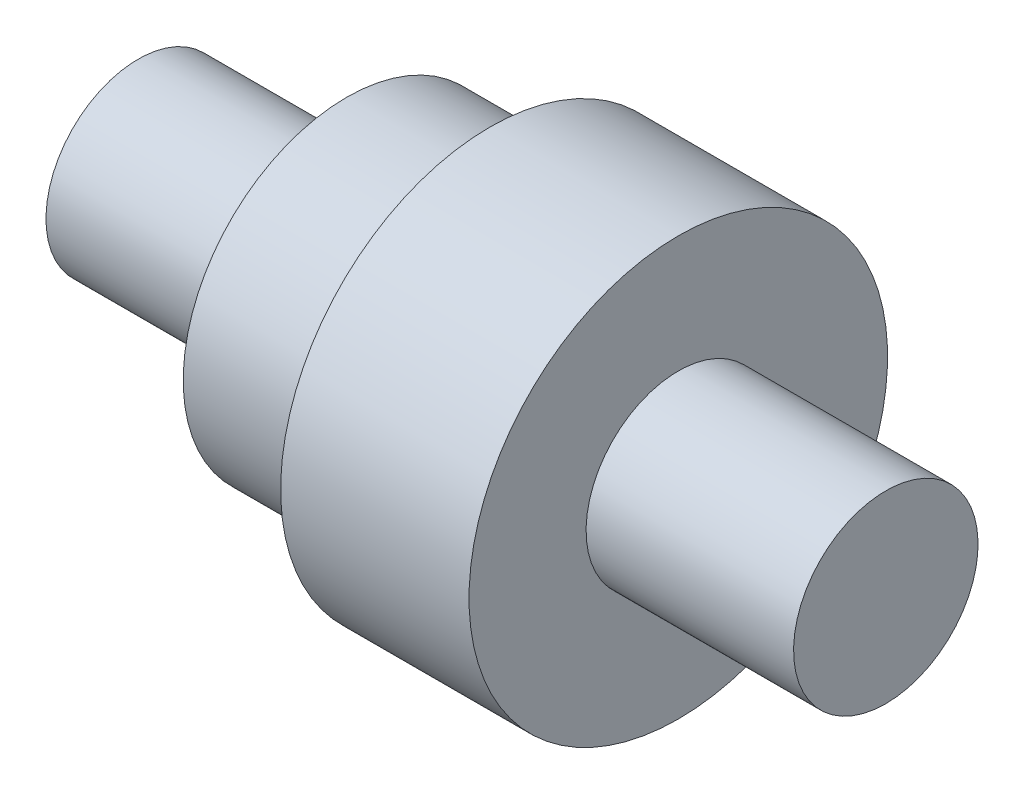
ISO-10303-21;
HEADER;
FILE_DESCRIPTION(('STEP AP214'),'2;1');
FILE_NAME('part.step','',(''),(''),'','','');
FILE_SCHEMA(('AUTOMOTIVE_DESIGN { 1 0 10303 214 1 1 1 1 }'));
ENDSEC;
DATA;
#1=APPLICATION_CONTEXT('core data for automotive mechanical design processes');
#2=APPLICATION_PROTOCOL_DEFINITION('international standard','automotive_design',2000,#1);
#3=PRODUCT_CONTEXT('',#1,'mechanical');
#4=PRODUCT('Part','Part','',(#3));
#5=PRODUCT_RELATED_PRODUCT_CATEGORY('part','',(#4));
#6=PRODUCT_DEFINITION_FORMATION('','',#4);
#7=PRODUCT_DEFINITION_CONTEXT('part definition',#1,'design');
#8=PRODUCT_DEFINITION('design','',#6,#7);
#9=PRODUCT_DEFINITION_SHAPE('','',#8);
#10=(LENGTH_UNIT() NAMED_UNIT(*) SI_UNIT(.MILLI.,.METRE.));
#11=(NAMED_UNIT(*) PLANE_ANGLE_UNIT() SI_UNIT($,.RADIAN.));
#12=(NAMED_UNIT(*) SI_UNIT($,.STERADIAN.) SOLID_ANGLE_UNIT());
#13=UNCERTAINTY_MEASURE_WITH_UNIT(LENGTH_MEASURE(1.E-05),#10,'distance_accuracy_value','');
#14=(GEOMETRIC_REPRESENTATION_CONTEXT(3) GLOBAL_UNCERTAINTY_ASSIGNED_CONTEXT((#13)) GLOBAL_UNIT_ASSIGNED_CONTEXT((#10,
#11,#12)) REPRESENTATION_CONTEXT('',''));
#15=CARTESIAN_POINT('',(0.,0.,0.));
#16=DIRECTION('',(0.,0.,1.));
#17=DIRECTION('',(1.,0.,0.));
#18=AXIS2_PLACEMENT_3D('',#15,#16,#17);
#19=CARTESIAN_POINT('',(-11.95,0.,0.));
#20=DIRECTION('',(1.,0.,0.));
#21=DIRECTION('',(0.,1.,0.));
#22=AXIS2_PLACEMENT_3D('',#19,#20,#21);
#23=PLANE('',#22);
#24=CARTESIAN_POINT('',(-11.95,0.,0.));
#25=DIRECTION('',(-1.,0.,0.));
#26=DIRECTION('',(0.,-1.,0.));
#27=AXIS2_PLACEMENT_3D('',#24,#25,#26);
#28=CIRCLE('',#27,3.13359790887331);
#29=CARTESIAN_POINT('',(-11.95,-3.13359790887331,0.));
#30=VERTEX_POINT('',#29);
#31=EDGE_CURVE('E72',#30,#30,#28,.T.);
#32=ORIENTED_EDGE('',*,*,#31,.T.);
#33=EDGE_LOOP('',(#32));
#34=FACE_BOUND('',#33,.T.);
#35=ADVANCED_FACE('F37',(#34),#23,.F.);
#36=CARTESIAN_POINT('',(13.45,0.,0.));
#37=DIRECTION('',(-1.,0.,0.));
#38=DIRECTION('',(0.,-1.,0.));
#39=AXIS2_PLACEMENT_3D('',#36,#37,#38);
#40=PLANE('',#39);
#41=CARTESIAN_POINT('',(13.45,0.,0.));
#42=DIRECTION('',(-1.,0.,0.));
#43=DIRECTION('',(0.,-1.,0.));
#44=AXIS2_PLACEMENT_3D('',#41,#42,#43);
#45=CIRCLE('',#44,3.1335979088733);
#46=CARTESIAN_POINT('',(13.45,-3.1335979088733,0.));
#47=VERTEX_POINT('',#46);
#48=EDGE_CURVE('E10',#47,#47,#45,.T.);
#49=ORIENTED_EDGE('',*,*,#48,.F.);
#50=EDGE_LOOP('',(#49));
#51=FACE_BOUND('',#50,.T.);
#52=ADVANCED_FACE('F90',(#51),#40,.F.);
#53=CARTESIAN_POINT('',(-4.87,0.,0.));
#54=DIRECTION('',(-1.,0.,0.));
#55=DIRECTION('',(0.,-1.,0.));
#56=AXIS2_PLACEMENT_3D('',#53,#54,#55);
#57=CYLINDRICAL_SURFACE('',#56,3.13359790887331);
#58=ORIENTED_EDGE('',*,*,#48,.T.);
#59=EDGE_LOOP('',(#58));
#60=FACE_BOUND('',#59,.T.);
#61=CARTESIAN_POINT('',(6.4,0.,0.));
#62=DIRECTION('',(-1.,0.,0.));
#63=DIRECTION('',(0.,-1.,0.));
#64=AXIS2_PLACEMENT_3D('',#61,#62,#63);
#65=CIRCLE('',#64,3.13359790887331);
#66=CARTESIAN_POINT('',(6.4,-3.13359790887331,0.));
#67=VERTEX_POINT('',#66);
#68=EDGE_CURVE('E44',#67,#67,#65,.T.);
#69=ORIENTED_EDGE('',*,*,#68,.F.);
#70=EDGE_LOOP('',(#69));
#71=FACE_BOUND('',#70,.T.);
#72=ADVANCED_FACE('F94',(#60,#71),#57,.T.);
#73=CARTESIAN_POINT('',(6.4,0.,0.));
#74=DIRECTION('',(1.,0.,0.));
#75=DIRECTION('',(0.,1.,0.));
#76=AXIS2_PLACEMENT_3D('',#73,#74,#75);
#77=PLANE('',#76);
#78=ORIENTED_EDGE('',*,*,#68,.T.);
#79=EDGE_LOOP('',(#78));
#80=FACE_BOUND('',#79,.T.);
#81=CARTESIAN_POINT('',(6.4,0.,0.));
#82=DIRECTION('',(-1.,0.,0.));
#83=DIRECTION('',(0.,-1.,0.));
#84=AXIS2_PLACEMENT_3D('',#81,#82,#83);
#85=CIRCLE('',#84,7.11);
#86=CARTESIAN_POINT('',(6.4,-7.11,0.));
#87=VERTEX_POINT('',#86);
#88=EDGE_CURVE('E49',#87,#87,#85,.T.);
#89=ORIENTED_EDGE('',*,*,#88,.F.);
#90=EDGE_LOOP('',(#89));
#91=FACE_BOUND('',#90,.T.);
#92=ADVANCED_FACE('F99',(#80,#91),#77,.T.);
#93=CARTESIAN_POINT('',(-4.87,0.,0.));
#94=DIRECTION('',(-1.,0.,0.));
#95=DIRECTION('',(0.,-1.,0.));
#96=AXIS2_PLACEMENT_3D('',#93,#94,#95);
#97=CYLINDRICAL_SURFACE('',#96,7.11);
#98=ORIENTED_EDGE('',*,*,#88,.T.);
#99=EDGE_LOOP('',(#98));
#100=FACE_BOUND('',#99,.T.);
#101=CARTESIAN_POINT('',(0.,0.,0.));
#102=DIRECTION('',(-1.,0.,0.));
#103=DIRECTION('',(0.,-1.,0.));
#104=AXIS2_PLACEMENT_3D('',#101,#102,#103);
#105=CIRCLE('',#104,7.11);
#106=CARTESIAN_POINT('',(0.,-7.11,0.));
#107=VERTEX_POINT('',#106);
#108=EDGE_CURVE('E54',#107,#107,#105,.T.);
#109=ORIENTED_EDGE('',*,*,#108,.F.);
#110=EDGE_LOOP('',(#109));
#111=FACE_BOUND('',#110,.T.);
#112=ADVANCED_FACE('F104',(#100,#111),#97,.T.);
#113=CARTESIAN_POINT('',(0.,0.,0.));
#114=DIRECTION('',(1.,0.,0.));
#115=DIRECTION('',(0.,1.,0.));
#116=AXIS2_PLACEMENT_3D('',#113,#114,#115);
#117=PLANE('',#116);
#118=CARTESIAN_POINT('',(0.,0.,0.));
#119=DIRECTION('',(-1.,0.,0.));
#120=DIRECTION('',(0.,-1.,0.));
#121=AXIS2_PLACEMENT_3D('',#118,#119,#120);
#122=CIRCLE('',#121,5.55);
#123=CARTESIAN_POINT('',(0.,-5.55,0.));
#124=VERTEX_POINT('',#123);
#125=EDGE_CURVE('E60',#124,#124,#122,.T.);
#126=ORIENTED_EDGE('',*,*,#125,.F.);
#127=EDGE_LOOP('',(#126));
#128=FACE_BOUND('',#127,.T.);
#129=ORIENTED_EDGE('',*,*,#108,.T.);
#130=EDGE_LOOP('',(#129));
#131=FACE_BOUND('',#130,.T.);
#132=ADVANCED_FACE('F107',(#128,#131),#117,.F.);
#133=CARTESIAN_POINT('',(-4.87,0.,0.));
#134=DIRECTION('',(-1.,0.,0.));
#135=DIRECTION('',(0.,-1.,0.));
#136=AXIS2_PLACEMENT_3D('',#133,#134,#135);
#137=CYLINDRICAL_SURFACE('',#136,5.55);
#138=CARTESIAN_POINT('',(-4.87,0.,0.));
#139=DIRECTION('',(-1.,0.,0.));
#140=DIRECTION('',(0.,-1.,0.));
#141=AXIS2_PLACEMENT_3D('',#138,#139,#140);
#142=CIRCLE('',#141,5.55);
#143=CARTESIAN_POINT('',(-4.87,-5.55,0.));
#144=VERTEX_POINT('',#143);
#145=EDGE_CURVE('E64',#144,#144,#142,.T.);
#146=ORIENTED_EDGE('',*,*,#145,.F.);
#147=EDGE_LOOP('',(#146));
#148=FACE_BOUND('',#147,.T.);
#149=ORIENTED_EDGE('',*,*,#125,.T.);
#150=EDGE_LOOP('',(#149));
#151=FACE_BOUND('',#150,.T.);
#152=ADVANCED_FACE('F86',(#148,#151),#137,.T.);
#153=CARTESIAN_POINT('',(-4.87,0.,0.));
#154=DIRECTION('',(1.,0.,0.));
#155=DIRECTION('',(0.,1.,0.));
#156=AXIS2_PLACEMENT_3D('',#153,#154,#155);
#157=PLANE('',#156);
#158=CARTESIAN_POINT('',(-4.87,0.,0.));
#159=DIRECTION('',(-1.,0.,0.));
#160=DIRECTION('',(0.,-1.,0.));
#161=AXIS2_PLACEMENT_3D('',#158,#159,#160);
#162=CIRCLE('',#161,3.13359790887331);
#163=CARTESIAN_POINT('',(-4.87,-3.13359790887331,0.));
#164=VERTEX_POINT('',#163);
#165=EDGE_CURVE('E68',#164,#164,#162,.T.);
#166=ORIENTED_EDGE('',*,*,#165,.F.);
#167=EDGE_LOOP('',(#166));
#168=FACE_BOUND('',#167,.T.);
#169=ORIENTED_EDGE('',*,*,#145,.T.);
#170=EDGE_LOOP('',(#169));
#171=FACE_BOUND('',#170,.T.);
#172=ADVANCED_FACE('F80',(#168,#171),#157,.F.);
#173=CARTESIAN_POINT('',(-4.87,0.,0.));
#174=DIRECTION('',(-1.,0.,0.));
#175=DIRECTION('',(0.,-1.,0.));
#176=AXIS2_PLACEMENT_3D('',#173,#174,#175);
#177=CYLINDRICAL_SURFACE('',#176,3.13359790887331);
#178=ORIENTED_EDGE('',*,*,#165,.T.);
#179=EDGE_LOOP('',(#178));
#180=FACE_BOUND('',#179,.T.);
#181=ORIENTED_EDGE('',*,*,#31,.F.);
#182=EDGE_LOOP('',(#181));
#183=FACE_BOUND('',#182,.T.);
#184=ADVANCED_FACE('F78',(#180,#183),#177,.T.);
#185=CLOSED_SHELL('',(#35,#52,#72,#92,#112,#132,#152,#172,#184));
#186=MANIFOLD_SOLID_BREP('B2',#185);
#187=ADVANCED_BREP_SHAPE_REPRESENTATION('',(#18,#186),#14);
#188=SHAPE_DEFINITION_REPRESENTATION(#9,#187);
ENDSEC;
END-ISO-10303-21;
